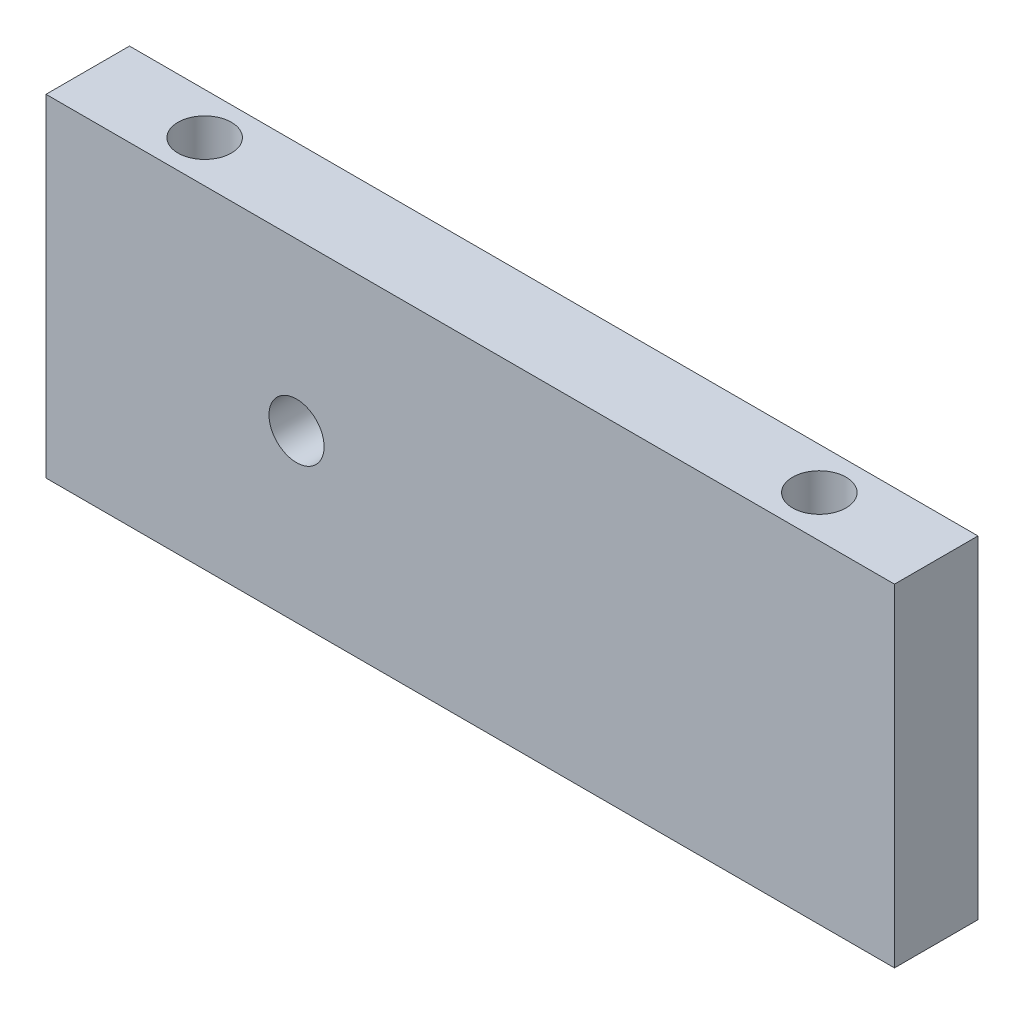
ISO-10303-21;
HEADER;
FILE_DESCRIPTION(('STEP AP214'),'2;1');
FILE_NAME('part.step','',(''),(''),'','','');
FILE_SCHEMA(('AUTOMOTIVE_DESIGN { 1 0 10303 214 1 1 1 1 }'));
ENDSEC;
DATA;
#1=APPLICATION_CONTEXT('core data for automotive mechanical design processes');
#2=APPLICATION_PROTOCOL_DEFINITION('international standard','automotive_design',2000,#1);
#3=PRODUCT_CONTEXT('',#1,'mechanical');
#4=PRODUCT('Part','Part','',(#3));
#5=PRODUCT_RELATED_PRODUCT_CATEGORY('part','',(#4));
#6=PRODUCT_DEFINITION_FORMATION('','',#4);
#7=PRODUCT_DEFINITION_CONTEXT('part definition',#1,'design');
#8=PRODUCT_DEFINITION('design','',#6,#7);
#9=PRODUCT_DEFINITION_SHAPE('','',#8);
#10=(LENGTH_UNIT() NAMED_UNIT(*) SI_UNIT(.MILLI.,.METRE.));
#11=(NAMED_UNIT(*) PLANE_ANGLE_UNIT() SI_UNIT($,.RADIAN.));
#12=(NAMED_UNIT(*) SI_UNIT($,.STERADIAN.) SOLID_ANGLE_UNIT());
#13=UNCERTAINTY_MEASURE_WITH_UNIT(LENGTH_MEASURE(1.E-05),#10,'distance_accuracy_value','');
#14=(GEOMETRIC_REPRESENTATION_CONTEXT(3) GLOBAL_UNCERTAINTY_ASSIGNED_CONTEXT((#13)) GLOBAL_UNIT_ASSIGNED_CONTEXT((#10,
#11,#12)) REPRESENTATION_CONTEXT('',''));
#15=CARTESIAN_POINT('',(0.,0.,0.));
#16=DIRECTION('',(0.,0.,1.));
#17=DIRECTION('',(1.,0.,0.));
#18=AXIS2_PLACEMENT_3D('',#15,#16,#17);
#19=CARTESIAN_POINT('',(-15.0000000000001,19.9,5.));
#20=DIRECTION('',(1.,0.,0.));
#21=DIRECTION('',(0.,1.,0.));
#22=AXIS2_PLACEMENT_3D('',#19,#20,#21);
#23=PLANE('',#22);
#24=DIRECTION('',(0.,-1.,0.));
#25=VECTOR('',#24,1.);
#26=CARTESIAN_POINT('',(-15.0000000000001,19.9,0.));
#27=LINE('',#26,#25);
#28=CARTESIAN_POINT('',(-15.0000000000001,19.9,0.));
#29=VERTEX_POINT('',#28);
#30=CARTESIAN_POINT('',(-15.,0.,0.));
#31=VERTEX_POINT('',#30);
#32=EDGE_CURVE('E93',#29,#31,#27,.T.);
#33=ORIENTED_EDGE('',*,*,#32,.T.);
#34=DIRECTION('',(0.,0.,-1.));
#35=VECTOR('',#34,1.);
#36=CARTESIAN_POINT('',(-15.,0.,5.));
#37=LINE('',#36,#35);
#38=CARTESIAN_POINT('',(-15.,0.,5.));
#39=VERTEX_POINT('',#38);
#40=EDGE_CURVE('E11',#39,#31,#37,.T.);
#41=ORIENTED_EDGE('',*,*,#40,.F.);
#42=DIRECTION('',(0.,-1.,0.));
#43=VECTOR('',#42,1.);
#44=CARTESIAN_POINT('',(-15.0000000000001,19.9,5.));
#45=LINE('',#44,#43);
#46=CARTESIAN_POINT('',(-15.0000000000001,19.9,5.));
#47=VERTEX_POINT('',#46);
#48=EDGE_CURVE('E81',#47,#39,#45,.T.);
#49=ORIENTED_EDGE('',*,*,#48,.F.);
#50=DIRECTION('',(0.,0.,-1.));
#51=VECTOR('',#50,1.);
#52=CARTESIAN_POINT('',(-15.0000000000001,19.9,5.));
#53=LINE('',#52,#51);
#54=EDGE_CURVE('E89',#47,#29,#53,.T.);
#55=ORIENTED_EDGE('',*,*,#54,.T.);
#56=EDGE_LOOP('',(#33,#41,#49,#55));
#57=FACE_BOUND('',#56,.T.);
#58=ADVANCED_FACE('F30',(#57),#23,.F.);
#59=CARTESIAN_POINT('',(-15.,0.,5.));
#60=DIRECTION('',(0.,1.,0.));
#61=DIRECTION('',(-1.,0.,0.));
#62=AXIS2_PLACEMENT_3D('',#59,#60,#61);
#63=PLANE('',#62);
#64=CARTESIAN_POINT('',(28.8000000000002,0.,2.49999999999985));
#65=DIRECTION('',(0.,1.,0.));
#66=DIRECTION('',(0.,0.,1.));
#67=AXIS2_PLACEMENT_3D('',#64,#65,#66);
#68=CIRCLE('',#67,1.59999999999983);
#69=CARTESIAN_POINT('',(28.8000000000002,0.,4.09999999999967));
#70=VERTEX_POINT('',#69);
#71=EDGE_CURVE('E116',#70,#70,#68,.T.);
#72=ORIENTED_EDGE('',*,*,#71,.T.);
#73=EDGE_LOOP('',(#72));
#74=FACE_BOUND('',#73,.T.);
#75=CARTESIAN_POINT('',(-8.00000000000005,0.,2.49999999999987));
#76=DIRECTION('',(0.,1.,0.));
#77=DIRECTION('',(0.,0.,1.));
#78=AXIS2_PLACEMENT_3D('',#75,#76,#77);
#79=CIRCLE('',#78,1.59999999999999);
#80=CARTESIAN_POINT('',(-8.00000000000005,0.,4.09999999999987));
#81=VERTEX_POINT('',#80);
#82=EDGE_CURVE('E112',#81,#81,#79,.T.);
#83=ORIENTED_EDGE('',*,*,#82,.T.);
#84=EDGE_LOOP('',(#83));
#85=FACE_BOUND('',#84,.T.);
#86=DIRECTION('',(1.,0.,0.));
#87=VECTOR('',#86,1.);
#88=CARTESIAN_POINT('',(-15.,0.,0.));
#89=LINE('',#88,#87);
#90=CARTESIAN_POINT('',(35.8000000000002,0.,0.));
#91=VERTEX_POINT('',#90);
#92=EDGE_CURVE('E85',#31,#91,#89,.T.);
#93=ORIENTED_EDGE('',*,*,#92,.T.);
#94=DIRECTION('',(0.,0.,-1.));
#95=VECTOR('',#94,1.);
#96=CARTESIAN_POINT('',(35.8000000000002,0.,5.));
#97=LINE('',#96,#95);
#98=CARTESIAN_POINT('',(35.8000000000002,0.,5.));
#99=VERTEX_POINT('',#98);
#100=EDGE_CURVE('E38',#99,#91,#97,.T.);
#101=ORIENTED_EDGE('',*,*,#100,.F.);
#102=DIRECTION('',(1.,0.,0.));
#103=VECTOR('',#102,1.);
#104=CARTESIAN_POINT('',(-15.,0.,5.));
#105=LINE('',#104,#103);
#106=EDGE_CURVE('E76',#39,#99,#105,.T.);
#107=ORIENTED_EDGE('',*,*,#106,.F.);
#108=ORIENTED_EDGE('',*,*,#40,.T.);
#109=EDGE_LOOP('',(#93,#101,#107,#108));
#110=FACE_BOUND('',#109,.T.);
#111=ADVANCED_FACE('F84',(#74,#85,#110),#63,.F.);
#112=CARTESIAN_POINT('',(35.7999999999999,19.9,5.));
#113=DIRECTION('',(-1.,0.,0.));
#114=DIRECTION('',(0.,-1.,0.));
#115=AXIS2_PLACEMENT_3D('',#112,#113,#114);
#116=PLANE('',#115);
#117=DIRECTION('',(0.,1.,0.));
#118=VECTOR('',#117,1.);
#119=CARTESIAN_POINT('',(35.7999999999999,19.9,0.));
#120=LINE('',#119,#118);
#121=CARTESIAN_POINT('',(35.7999999999999,19.9,0.));
#122=VERTEX_POINT('',#121);
#123=EDGE_CURVE('E63',#91,#122,#120,.T.);
#124=ORIENTED_EDGE('',*,*,#123,.T.);
#125=DIRECTION('',(0.,0.,-1.));
#126=VECTOR('',#125,1.);
#127=CARTESIAN_POINT('',(35.7999999999999,19.9,5.));
#128=LINE('',#127,#126);
#129=CARTESIAN_POINT('',(35.7999999999999,19.9,5.));
#130=VERTEX_POINT('',#129);
#131=EDGE_CURVE('E86',#130,#122,#128,.T.);
#132=ORIENTED_EDGE('',*,*,#131,.F.);
#133=DIRECTION('',(0.,1.,0.));
#134=VECTOR('',#133,1.);
#135=CARTESIAN_POINT('',(35.7999999999999,19.9,5.));
#136=LINE('',#135,#134);
#137=EDGE_CURVE('E79',#99,#130,#136,.T.);
#138=ORIENTED_EDGE('',*,*,#137,.F.);
#139=ORIENTED_EDGE('',*,*,#100,.T.);
#140=EDGE_LOOP('',(#124,#132,#138,#139));
#141=FACE_BOUND('',#140,.T.);
#142=ADVANCED_FACE('F87',(#141),#116,.F.);
#143=CARTESIAN_POINT('',(-15.0000000000001,19.9,5.));
#144=DIRECTION('',(0.,-1.,0.));
#145=DIRECTION('',(0.,0.,-1.));
#146=AXIS2_PLACEMENT_3D('',#143,#144,#145);
#147=PLANE('',#146);
#148=CARTESIAN_POINT('',(28.8000000000002,19.9,2.49999999999985));
#149=DIRECTION('',(0.,1.,0.));
#150=DIRECTION('',(0.,0.,1.));
#151=AXIS2_PLACEMENT_3D('',#148,#149,#150);
#152=CIRCLE('',#151,1.59999999999983);
#153=CARTESIAN_POINT('',(28.8000000000002,19.9,4.09999999999967));
#154=VERTEX_POINT('',#153);
#155=EDGE_CURVE('E119',#154,#154,#152,.T.);
#156=ORIENTED_EDGE('',*,*,#155,.F.);
#157=EDGE_LOOP('',(#156));
#158=FACE_BOUND('',#157,.T.);
#159=CARTESIAN_POINT('',(-8.00000000000005,19.9,2.49999999999987));
#160=DIRECTION('',(0.,1.,0.));
#161=DIRECTION('',(0.,0.,1.));
#162=AXIS2_PLACEMENT_3D('',#159,#160,#161);
#163=CIRCLE('',#162,1.59999999999999);
#164=CARTESIAN_POINT('',(-8.00000000000005,19.9,4.09999999999987));
#165=VERTEX_POINT('',#164);
#166=EDGE_CURVE('E113',#165,#165,#163,.T.);
#167=ORIENTED_EDGE('',*,*,#166,.F.);
#168=EDGE_LOOP('',(#167));
#169=FACE_BOUND('',#168,.T.);
#170=DIRECTION('',(-1.,0.,0.));
#171=VECTOR('',#170,1.);
#172=CARTESIAN_POINT('',(-15.0000000000001,19.9,0.));
#173=LINE('',#172,#171);
#174=EDGE_CURVE('E69',#122,#29,#173,.T.);
#175=ORIENTED_EDGE('',*,*,#174,.T.);
#176=ORIENTED_EDGE('',*,*,#54,.F.);
#177=DIRECTION('',(-1.,0.,0.));
#178=VECTOR('',#177,1.);
#179=CARTESIAN_POINT('',(-15.0000000000001,19.9,5.));
#180=LINE('',#179,#178);
#181=EDGE_CURVE('E46',#130,#47,#180,.T.);
#182=ORIENTED_EDGE('',*,*,#181,.F.);
#183=ORIENTED_EDGE('',*,*,#131,.T.);
#184=EDGE_LOOP('',(#175,#176,#182,#183));
#185=FACE_BOUND('',#184,.T.);
#186=ADVANCED_FACE('F101',(#158,#169,#185),#147,.F.);
#187=CARTESIAN_POINT('',(-15.,0.,5.));
#188=DIRECTION('',(0.,0.,1.));
#189=DIRECTION('',(1.,0.,0.));
#190=AXIS2_PLACEMENT_3D('',#187,#188,#189);
#191=PLANE('',#190);
#192=CARTESIAN_POINT('',(0.,9.95000000000005,5.));
#193=DIRECTION('',(0.,0.,1.));
#194=DIRECTION('',(1.,0.,0.));
#195=AXIS2_PLACEMENT_3D('',#192,#193,#194);
#196=CIRCLE('',#195,1.64999999999999);
#197=CARTESIAN_POINT('',(1.64999999999994,9.95000000000005,5.));
#198=VERTEX_POINT('',#197);
#199=EDGE_CURVE('E109',#198,#198,#196,.T.);
#200=ORIENTED_EDGE('',*,*,#199,.F.);
#201=EDGE_LOOP('',(#200));
#202=FACE_BOUND('',#201,.T.);
#203=ORIENTED_EDGE('',*,*,#48,.T.);
#204=ORIENTED_EDGE('',*,*,#106,.T.);
#205=ORIENTED_EDGE('',*,*,#137,.T.);
#206=ORIENTED_EDGE('',*,*,#181,.T.);
#207=EDGE_LOOP('',(#203,#204,#205,#206));
#208=FACE_BOUND('',#207,.T.);
#209=ADVANCED_FACE('F77',(#202,#208),#191,.T.);
#210=CARTESIAN_POINT('',(-15.,0.,0.));
#211=DIRECTION('',(0.,0.,1.));
#212=DIRECTION('',(1.,0.,0.));
#213=AXIS2_PLACEMENT_3D('',#210,#211,#212);
#214=PLANE('',#213);
#215=CARTESIAN_POINT('',(0.,9.95000000000005,0.));
#216=DIRECTION('',(0.,0.,1.));
#217=DIRECTION('',(1.,0.,0.));
#218=AXIS2_PLACEMENT_3D('',#215,#216,#217);
#219=CIRCLE('',#218,1.65);
#220=CARTESIAN_POINT('',(1.64999999999995,9.95000000000005,0.));
#221=VERTEX_POINT('',#220);
#222=EDGE_CURVE('E96',#221,#221,#219,.T.);
#223=ORIENTED_EDGE('',*,*,#222,.T.);
#224=EDGE_LOOP('',(#223));
#225=FACE_BOUND('',#224,.T.);
#226=ORIENTED_EDGE('',*,*,#32,.F.);
#227=ORIENTED_EDGE('',*,*,#174,.F.);
#228=ORIENTED_EDGE('',*,*,#123,.F.);
#229=ORIENTED_EDGE('',*,*,#92,.F.);
#230=EDGE_LOOP('',(#226,#227,#228,#229));
#231=FACE_BOUND('',#230,.T.);
#232=ADVANCED_FACE('F104',(#225,#231),#214,.F.);
#233=CARTESIAN_POINT('',(0.,9.95000000000005,5.));
#234=DIRECTION('',(0.,0.,1.));
#235=DIRECTION('',(1.,0.,0.));
#236=AXIS2_PLACEMENT_3D('',#233,#234,#235);
#237=CYLINDRICAL_SURFACE('',#236,1.64999999999999);
#238=ORIENTED_EDGE('',*,*,#222,.F.);
#239=EDGE_LOOP('',(#238));
#240=FACE_BOUND('',#239,.T.);
#241=ORIENTED_EDGE('',*,*,#199,.T.);
#242=EDGE_LOOP('',(#241));
#243=FACE_BOUND('',#242,.T.);
#244=ADVANCED_FACE('F140',(#240,#243),#237,.F.);
#245=CARTESIAN_POINT('',(-8.00000000000005,0.,2.49999999999987));
#246=DIRECTION('',(0.,1.,0.));
#247=DIRECTION('',(0.,0.,1.));
#248=AXIS2_PLACEMENT_3D('',#245,#246,#247);
#249=CYLINDRICAL_SURFACE('',#248,1.59999999999999);
#250=ORIENTED_EDGE('',*,*,#82,.F.);
#251=EDGE_LOOP('',(#250));
#252=FACE_BOUND('',#251,.T.);
#253=ORIENTED_EDGE('',*,*,#166,.T.);
#254=EDGE_LOOP('',(#253));
#255=FACE_BOUND('',#254,.T.);
#256=ADVANCED_FACE('F130',(#252,#255),#249,.F.);
#257=CARTESIAN_POINT('',(28.8000000000002,0.,2.49999999999985));
#258=DIRECTION('',(0.,1.,0.));
#259=DIRECTION('',(0.,0.,1.));
#260=AXIS2_PLACEMENT_3D('',#257,#258,#259);
#261=CYLINDRICAL_SURFACE('',#260,1.59999999999983);
#262=ORIENTED_EDGE('',*,*,#71,.F.);
#263=EDGE_LOOP('',(#262));
#264=FACE_BOUND('',#263,.T.);
#265=ORIENTED_EDGE('',*,*,#155,.T.);
#266=EDGE_LOOP('',(#265));
#267=FACE_BOUND('',#266,.T.);
#268=ADVANCED_FACE('F127',(#264,#267),#261,.F.);
#269=CLOSED_SHELL('',(#58,#111,#142,#186,#209,#232,#244,#256,#268));
#270=MANIFOLD_SOLID_BREP('B2',#269);
#271=ADVANCED_BREP_SHAPE_REPRESENTATION('',(#18,#270),#14);
#272=SHAPE_DEFINITION_REPRESENTATION(#9,#271);
ENDSEC;
END-ISO-10303-21;
